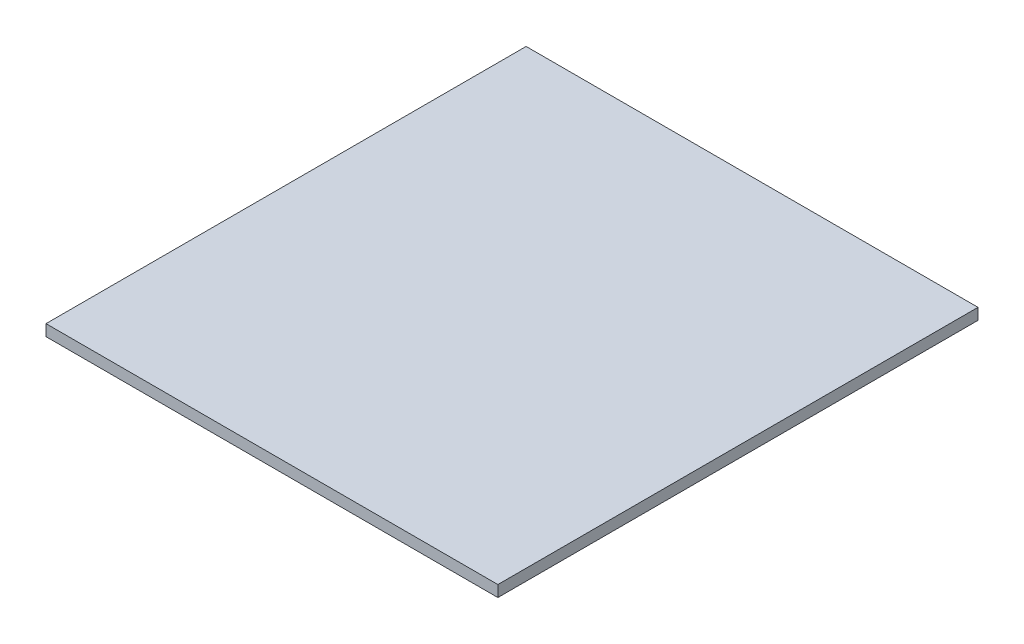
ISO-10303-21;
HEADER;
FILE_DESCRIPTION(('STEP AP214'),'2;1');
FILE_NAME('part.step','',(''),(''),'','','');
FILE_SCHEMA(('AUTOMOTIVE_DESIGN { 1 0 10303 214 1 1 1 1 }'));
ENDSEC;
DATA;
#1=APPLICATION_CONTEXT('core data for automotive mechanical design processes');
#2=APPLICATION_PROTOCOL_DEFINITION('international standard','automotive_design',2000,#1);
#3=PRODUCT_CONTEXT('',#1,'mechanical');
#4=PRODUCT('Part','Part','',(#3));
#5=PRODUCT_RELATED_PRODUCT_CATEGORY('part','',(#4));
#6=PRODUCT_DEFINITION_FORMATION('','',#4);
#7=PRODUCT_DEFINITION_CONTEXT('part definition',#1,'design');
#8=PRODUCT_DEFINITION('design','',#6,#7);
#9=PRODUCT_DEFINITION_SHAPE('','',#8);
#10=(LENGTH_UNIT() NAMED_UNIT(*) SI_UNIT(.MILLI.,.METRE.));
#11=(NAMED_UNIT(*) PLANE_ANGLE_UNIT() SI_UNIT($,.RADIAN.));
#12=(NAMED_UNIT(*) SI_UNIT($,.STERADIAN.) SOLID_ANGLE_UNIT());
#13=UNCERTAINTY_MEASURE_WITH_UNIT(LENGTH_MEASURE(1.E-05),#10,'distance_accuracy_value','');
#14=(GEOMETRIC_REPRESENTATION_CONTEXT(3) GLOBAL_UNCERTAINTY_ASSIGNED_CONTEXT((#13)) GLOBAL_UNIT_ASSIGNED_CONTEXT((#10,
#11,#12)) REPRESENTATION_CONTEXT('',''));
#15=CARTESIAN_POINT('',(0.,0.,0.));
#16=DIRECTION('',(0.,0.,1.));
#17=DIRECTION('',(1.,0.,0.));
#18=AXIS2_PLACEMENT_3D('',#15,#16,#17);
#19=CARTESIAN_POINT('',(-58.4225331348375,-20.,-39.8335453192074));
#20=DIRECTION('',(-1.,0.,0.));
#21=DIRECTION('',(0.,0.,1.));
#22=AXIS2_PLACEMENT_3D('',#19,#20,#21);
#23=PLANE('',#22);
#24=DIRECTION('',(0.,0.,1.));
#25=VECTOR('',#24,1.);
#26=CARTESIAN_POINT('',(-58.4225331348375,0.,-39.8335453192074));
#27=LINE('',#26,#25);
#28=CARTESIAN_POINT('',(-58.4225331348375,0.,-39.8335453192074));
#29=VERTEX_POINT('',#28);
#30=CARTESIAN_POINT('',(-58.4225331348374,0.,810.166454680793));
#31=VERTEX_POINT('',#30);
#32=EDGE_CURVE('E99',#29,#31,#27,.T.);
#33=ORIENTED_EDGE('',*,*,#32,.F.);
#34=DIRECTION('',(0.,1.,0.));
#35=VECTOR('',#34,1.);
#36=CARTESIAN_POINT('',(-58.4225331348375,-20.,-39.8335453192074));
#37=LINE('',#36,#35);
#38=CARTESIAN_POINT('',(-58.4225331348375,-20.,-39.8335453192074));
#39=VERTEX_POINT('',#38);
#40=EDGE_CURVE('E11',#39,#29,#37,.T.);
#41=ORIENTED_EDGE('',*,*,#40,.F.);
#42=DIRECTION('',(0.,0.,1.));
#43=VECTOR('',#42,1.);
#44=CARTESIAN_POINT('',(-58.4225331348375,-20.,-39.8335453192074));
#45=LINE('',#44,#43);
#46=CARTESIAN_POINT('',(-58.4225331348374,-20.,810.166454680793));
#47=VERTEX_POINT('',#46);
#48=EDGE_CURVE('E93',#39,#47,#45,.T.);
#49=ORIENTED_EDGE('',*,*,#48,.T.);
#50=DIRECTION('',(0.,1.,0.));
#51=VECTOR('',#50,1.);
#52=CARTESIAN_POINT('',(-58.4225331348374,-20.,810.166454680793));
#53=LINE('',#52,#51);
#54=EDGE_CURVE('E38',#47,#31,#53,.T.);
#55=ORIENTED_EDGE('',*,*,#54,.T.);
#56=EDGE_LOOP('',(#33,#41,#49,#55));
#57=FACE_BOUND('',#56,.T.);
#58=ADVANCED_FACE('F35',(#57),#23,.T.);
#59=CARTESIAN_POINT('',(-58.4225331348375,-20.,-39.8335453192074));
#60=DIRECTION('',(0.,0.,-1.));
#61=DIRECTION('',(-1.,0.,0.));
#62=AXIS2_PLACEMENT_3D('',#59,#60,#61);
#63=PLANE('',#62);
#64=DIRECTION('',(-1.,0.,0.));
#65=VECTOR('',#64,1.);
#66=CARTESIAN_POINT('',(-58.4225331348375,0.,-39.8335453192074));
#67=LINE('',#66,#65);
#68=CARTESIAN_POINT('',(741.577466865163,0.,-39.8335453192074));
#69=VERTEX_POINT('',#68);
#70=EDGE_CURVE('E95',#69,#29,#67,.T.);
#71=ORIENTED_EDGE('',*,*,#70,.F.);
#72=DIRECTION('',(0.,1.,0.));
#73=VECTOR('',#72,1.);
#74=CARTESIAN_POINT('',(741.577466865163,-20.,-39.8335453192074));
#75=LINE('',#74,#73);
#76=CARTESIAN_POINT('',(741.577466865163,-20.,-39.8335453192074));
#77=VERTEX_POINT('',#76);
#78=EDGE_CURVE('E44',#77,#69,#75,.T.);
#79=ORIENTED_EDGE('',*,*,#78,.F.);
#80=DIRECTION('',(-1.,0.,0.));
#81=VECTOR('',#80,1.);
#82=CARTESIAN_POINT('',(-58.4225331348375,-20.,-39.8335453192074));
#83=LINE('',#82,#81);
#84=EDGE_CURVE('E90',#77,#39,#83,.T.);
#85=ORIENTED_EDGE('',*,*,#84,.T.);
#86=ORIENTED_EDGE('',*,*,#40,.T.);
#87=EDGE_LOOP('',(#71,#79,#85,#86));
#88=FACE_BOUND('',#87,.T.);
#89=ADVANCED_FACE('F109',(#88),#63,.T.);
#90=CARTESIAN_POINT('',(741.577466865163,-20.,-39.8335453192074));
#91=DIRECTION('',(1.,0.,0.));
#92=DIRECTION('',(0.,0.,-1.));
#93=AXIS2_PLACEMENT_3D('',#90,#91,#92);
#94=PLANE('',#93);
#95=DIRECTION('',(0.,0.,-1.));
#96=VECTOR('',#95,1.);
#97=CARTESIAN_POINT('',(741.577466865163,0.,-39.8335453192074));
#98=LINE('',#97,#96);
#99=CARTESIAN_POINT('',(741.577466865163,0.,810.166454680793));
#100=VERTEX_POINT('',#99);
#101=EDGE_CURVE('E85',#100,#69,#98,.T.);
#102=ORIENTED_EDGE('',*,*,#101,.F.);
#103=DIRECTION('',(0.,1.,0.));
#104=VECTOR('',#103,1.);
#105=CARTESIAN_POINT('',(741.577466865163,-20.,810.166454680793));
#106=LINE('',#105,#104);
#107=CARTESIAN_POINT('',(741.577466865163,-20.,810.166454680793));
#108=VERTEX_POINT('',#107);
#109=EDGE_CURVE('E80',#108,#100,#106,.T.);
#110=ORIENTED_EDGE('',*,*,#109,.F.);
#111=DIRECTION('',(0.,0.,-1.));
#112=VECTOR('',#111,1.);
#113=CARTESIAN_POINT('',(741.577466865163,-20.,-39.8335453192074));
#114=LINE('',#113,#112);
#115=EDGE_CURVE('E83',#108,#77,#114,.T.);
#116=ORIENTED_EDGE('',*,*,#115,.T.);
#117=ORIENTED_EDGE('',*,*,#78,.T.);
#118=EDGE_LOOP('',(#102,#110,#116,#117));
#119=FACE_BOUND('',#118,.T.);
#120=ADVANCED_FACE('F82',(#119),#94,.T.);
#121=CARTESIAN_POINT('',(-58.4225331348374,-20.,810.166454680793));
#122=DIRECTION('',(0.,0.,1.));
#123=DIRECTION('',(1.,0.,0.));
#124=AXIS2_PLACEMENT_3D('',#121,#122,#123);
#125=PLANE('',#124);
#126=DIRECTION('',(1.,0.,0.));
#127=VECTOR('',#126,1.);
#128=CARTESIAN_POINT('',(-58.4225331348374,0.,810.166454680793));
#129=LINE('',#128,#127);
#130=EDGE_CURVE('E102',#31,#100,#129,.T.);
#131=ORIENTED_EDGE('',*,*,#130,.F.);
#132=ORIENTED_EDGE('',*,*,#54,.F.);
#133=DIRECTION('',(1.,0.,0.));
#134=VECTOR('',#133,1.);
#135=CARTESIAN_POINT('',(-58.4225331348374,-20.,810.166454680793));
#136=LINE('',#135,#134);
#137=EDGE_CURVE('E89',#47,#108,#136,.T.);
#138=ORIENTED_EDGE('',*,*,#137,.T.);
#139=ORIENTED_EDGE('',*,*,#109,.T.);
#140=EDGE_LOOP('',(#131,#132,#138,#139));
#141=FACE_BOUND('',#140,.T.);
#142=ADVANCED_FACE('F92',(#141),#125,.T.);
#143=CARTESIAN_POINT('',(0.,-20.,0.));
#144=DIRECTION('',(0.,1.,0.));
#145=DIRECTION('',(0.,0.,1.));
#146=AXIS2_PLACEMENT_3D('',#143,#144,#145);
#147=PLANE('',#146);
#148=ORIENTED_EDGE('',*,*,#48,.F.);
#149=ORIENTED_EDGE('',*,*,#84,.F.);
#150=ORIENTED_EDGE('',*,*,#115,.F.);
#151=ORIENTED_EDGE('',*,*,#137,.F.);
#152=EDGE_LOOP('',(#148,#149,#150,#151));
#153=FACE_BOUND('',#152,.T.);
#154=ADVANCED_FACE('F88',(#153),#147,.F.);
#155=CARTESIAN_POINT('',(0.,0.,0.));
#156=DIRECTION('',(0.,1.,0.));
#157=DIRECTION('',(0.,0.,1.));
#158=AXIS2_PLACEMENT_3D('',#155,#156,#157);
#159=PLANE('',#158);
#160=ORIENTED_EDGE('',*,*,#32,.T.);
#161=ORIENTED_EDGE('',*,*,#130,.T.);
#162=ORIENTED_EDGE('',*,*,#101,.T.);
#163=ORIENTED_EDGE('',*,*,#70,.T.);
#164=EDGE_LOOP('',(#160,#161,#162,#163));
#165=FACE_BOUND('',#164,.T.);
#166=ADVANCED_FACE('F108',(#165),#159,.T.);
#167=CLOSED_SHELL('',(#58,#89,#120,#142,#154,#166));
#168=MANIFOLD_SOLID_BREP('B2',#167);
#169=ADVANCED_BREP_SHAPE_REPRESENTATION('',(#18,#168),#14);
#170=SHAPE_DEFINITION_REPRESENTATION(#9,#169);
ENDSEC;
END-ISO-10303-21;
